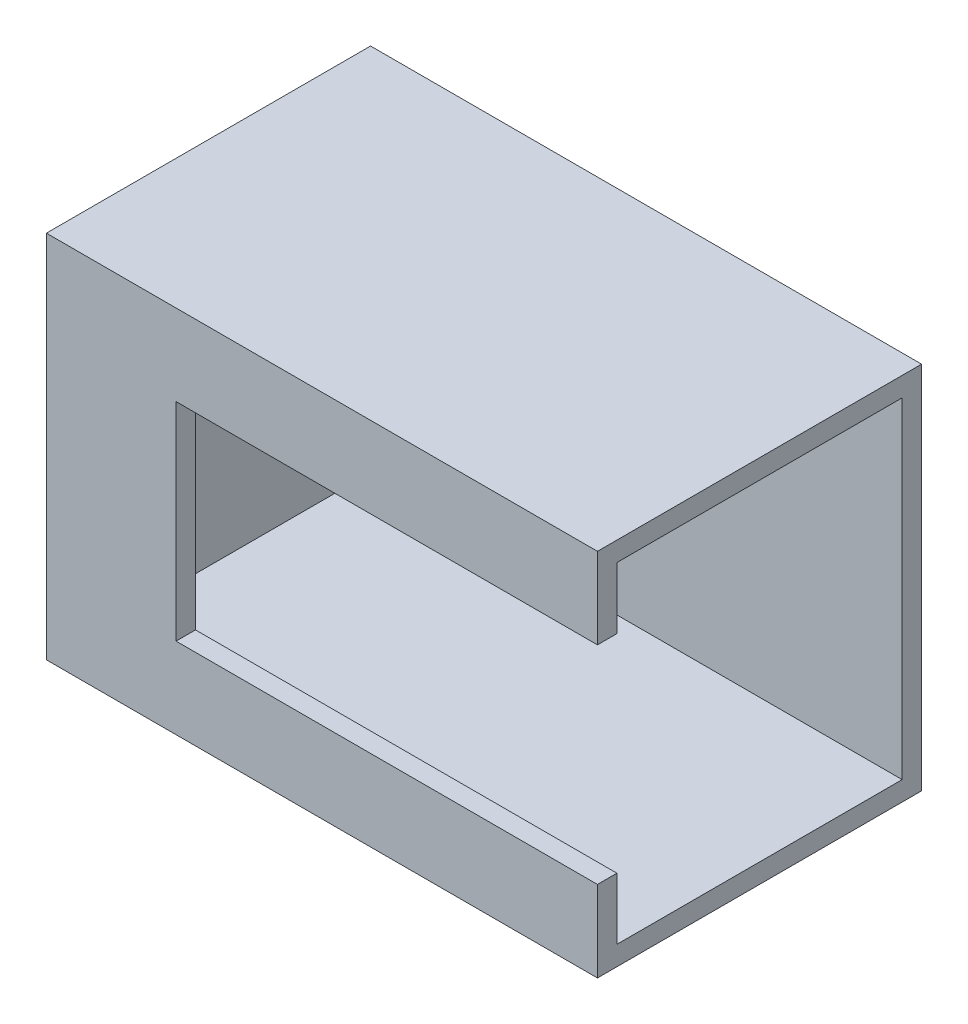
ISO-10303-21;
HEADER;
FILE_DESCRIPTION(('STEP AP214'),'2;1');
FILE_NAME('part.step','',(''),(''),'','','');
FILE_SCHEMA(('AUTOMOTIVE_DESIGN { 1 0 10303 214 1 1 1 1 }'));
ENDSEC;
DATA;
#1=APPLICATION_CONTEXT('core data for automotive mechanical design processes');
#2=APPLICATION_PROTOCOL_DEFINITION('international standard','automotive_design',2000,#1);
#3=PRODUCT_CONTEXT('',#1,'mechanical');
#4=PRODUCT('Part','Part','',(#3));
#5=PRODUCT_RELATED_PRODUCT_CATEGORY('part','',(#4));
#6=PRODUCT_DEFINITION_FORMATION('','',#4);
#7=PRODUCT_DEFINITION_CONTEXT('part definition',#1,'design');
#8=PRODUCT_DEFINITION('design','',#6,#7);
#9=PRODUCT_DEFINITION_SHAPE('','',#8);
#10=(LENGTH_UNIT() NAMED_UNIT(*) SI_UNIT(.MILLI.,.METRE.));
#11=(NAMED_UNIT(*) PLANE_ANGLE_UNIT() SI_UNIT($,.RADIAN.));
#12=(NAMED_UNIT(*) SI_UNIT($,.STERADIAN.) SOLID_ANGLE_UNIT());
#13=UNCERTAINTY_MEASURE_WITH_UNIT(LENGTH_MEASURE(1.E-05),#10,'distance_accuracy_value','');
#14=(GEOMETRIC_REPRESENTATION_CONTEXT(3) GLOBAL_UNCERTAINTY_ASSIGNED_CONTEXT((#13)) GLOBAL_UNIT_ASSIGNED_CONTEXT((#10,
#11,#12)) REPRESENTATION_CONTEXT('',''));
#15=CARTESIAN_POINT('',(0.,0.,0.));
#16=DIRECTION('',(0.,0.,1.));
#17=DIRECTION('',(1.,0.,0.));
#18=AXIS2_PLACEMENT_3D('',#15,#16,#17);
#19=CARTESIAN_POINT('',(42.5,57.,25.));
#20=DIRECTION('',(-1.,0.,0.));
#21=DIRECTION('',(0.,0.,1.));
#22=AXIS2_PLACEMENT_3D('',#19,#20,#21);
#23=PLANE('',#22);
#24=DIRECTION('',(0.,-1.,0.));
#25=VECTOR('',#24,1.);
#26=CARTESIAN_POINT('',(42.5,57.,25.));
#27=LINE('',#26,#25);
#28=CARTESIAN_POINT('',(42.5,57.,25.));
#29=VERTEX_POINT('',#28);
#30=CARTESIAN_POINT('',(42.5,44.5,25.));
#31=VERTEX_POINT('',#30);
#32=EDGE_CURVE('E247',#29,#31,#27,.T.);
#33=ORIENTED_EDGE('',*,*,#32,.T.);
#34=DIRECTION('',(0.,0.,1.));
#35=VECTOR('',#34,1.);
#36=CARTESIAN_POINT('',(42.5,44.5,-25.001));
#37=LINE('',#36,#35);
#38=CARTESIAN_POINT('',(42.5,44.5,22.));
#39=VERTEX_POINT('',#38);
#40=EDGE_CURVE('E173',#39,#31,#37,.T.);
#41=ORIENTED_EDGE('',*,*,#40,.F.);
#42=DIRECTION('',(0.,1.,0.));
#43=VECTOR('',#42,1.);
#44=CARTESIAN_POINT('',(42.5,0.,22.));
#45=LINE('',#44,#43);
#46=CARTESIAN_POINT('',(42.5,54.,22.));
#47=VERTEX_POINT('',#46);
#48=EDGE_CURVE('E68',#39,#47,#45,.T.);
#49=ORIENTED_EDGE('',*,*,#48,.T.);
#50=DIRECTION('',(0.,0.,-1.));
#51=VECTOR('',#50,1.);
#52=CARTESIAN_POINT('',(42.5,54.,0.));
#53=LINE('',#52,#51);
#54=CARTESIAN_POINT('',(42.5,54.,-22.));
#55=VERTEX_POINT('',#54);
#56=EDGE_CURVE('E178',#47,#55,#53,.T.);
#57=ORIENTED_EDGE('',*,*,#56,.T.);
#58=DIRECTION('',(0.,1.,0.));
#59=VECTOR('',#58,1.);
#60=CARTESIAN_POINT('',(42.5,0.,-22.));
#61=LINE('',#60,#59);
#62=CARTESIAN_POINT('',(42.5,2.99999999999999,-22.));
#63=VERTEX_POINT('',#62);
#64=EDGE_CURVE('E183',#63,#55,#61,.T.);
#65=ORIENTED_EDGE('',*,*,#64,.F.);
#66=DIRECTION('',(0.,0.,-1.));
#67=VECTOR('',#66,1.);
#68=CARTESIAN_POINT('',(42.5,2.99999999999999,0.));
#69=LINE('',#68,#67);
#70=CARTESIAN_POINT('',(42.5,2.99999999999999,22.));
#71=VERTEX_POINT('',#70);
#72=EDGE_CURVE('E201',#71,#63,#69,.T.);
#73=ORIENTED_EDGE('',*,*,#72,.F.);
#74=CARTESIAN_POINT('',(42.5,12.5,22.));
#75=VERTEX_POINT('',#74);
#76=EDGE_CURVE('E197',#71,#75,#45,.T.);
#77=ORIENTED_EDGE('',*,*,#76,.T.);
#78=DIRECTION('',(0.,0.,1.));
#79=VECTOR('',#78,1.);
#80=CARTESIAN_POINT('',(42.5,12.5,-25.001));
#81=LINE('',#80,#79);
#82=CARTESIAN_POINT('',(42.5,12.5,25.));
#83=VERTEX_POINT('',#82);
#84=EDGE_CURVE('E60',#75,#83,#81,.T.);
#85=ORIENTED_EDGE('',*,*,#84,.T.);
#86=CARTESIAN_POINT('',(42.5,0.,25.));
#87=VERTEX_POINT('',#86);
#88=EDGE_CURVE('E234',#83,#87,#27,.T.);
#89=ORIENTED_EDGE('',*,*,#88,.T.);
#90=DIRECTION('',(0.,0.,-1.));
#91=VECTOR('',#90,1.);
#92=CARTESIAN_POINT('',(42.5,0.,25.));
#93=LINE('',#92,#91);
#94=CARTESIAN_POINT('',(42.5,0.,-25.));
#95=VERTEX_POINT('',#94);
#96=EDGE_CURVE('E211',#87,#95,#93,.T.);
#97=ORIENTED_EDGE('',*,*,#96,.T.);
#98=DIRECTION('',(0.,-1.,0.));
#99=VECTOR('',#98,1.);
#100=CARTESIAN_POINT('',(42.5,57.,-25.));
#101=LINE('',#100,#99);
#102=CARTESIAN_POINT('',(42.5,57.,-25.));
#103=VERTEX_POINT('',#102);
#104=EDGE_CURVE('E11',#103,#95,#101,.T.);
#105=ORIENTED_EDGE('',*,*,#104,.F.);
#106=DIRECTION('',(0.,0.,-1.));
#107=VECTOR('',#106,1.);
#108=CARTESIAN_POINT('',(42.5,57.,25.));
#109=LINE('',#108,#107);
#110=EDGE_CURVE('E220',#29,#103,#109,.T.);
#111=ORIENTED_EDGE('',*,*,#110,.F.);
#112=EDGE_LOOP('',(#33,#41,#49,#57,#65,#73,#77,#85,#89,#97,#105,#111));
#113=FACE_BOUND('',#112,.T.);
#114=ADVANCED_FACE('F45',(#113),#23,.F.);
#115=CARTESIAN_POINT('',(-42.5,57.,-25.));
#116=DIRECTION('',(0.,0.,1.));
#117=DIRECTION('',(1.,0.,0.));
#118=AXIS2_PLACEMENT_3D('',#115,#116,#117);
#119=PLANE('',#118);
#120=DIRECTION('',(-1.,0.,0.));
#121=VECTOR('',#120,1.);
#122=CARTESIAN_POINT('',(-42.5,0.,-25.));
#123=LINE('',#122,#121);
#124=CARTESIAN_POINT('',(-42.5,0.,-25.));
#125=VERTEX_POINT('',#124);
#126=EDGE_CURVE('E238',#95,#125,#123,.T.);
#127=ORIENTED_EDGE('',*,*,#126,.T.);
#128=DIRECTION('',(0.,-1.,0.));
#129=VECTOR('',#128,1.);
#130=CARTESIAN_POINT('',(-42.5,57.,-25.));
#131=LINE('',#130,#129);
#132=CARTESIAN_POINT('',(-42.5,57.,-25.));
#133=VERTEX_POINT('',#132);
#134=EDGE_CURVE('E53',#133,#125,#131,.T.);
#135=ORIENTED_EDGE('',*,*,#134,.F.);
#136=DIRECTION('',(-1.,0.,0.));
#137=VECTOR('',#136,1.);
#138=CARTESIAN_POINT('',(-42.5,57.,-25.));
#139=LINE('',#138,#137);
#140=EDGE_CURVE('E224',#103,#133,#139,.T.);
#141=ORIENTED_EDGE('',*,*,#140,.F.);
#142=ORIENTED_EDGE('',*,*,#104,.T.);
#143=EDGE_LOOP('',(#127,#135,#141,#142));
#144=FACE_BOUND('',#143,.T.);
#145=ADVANCED_FACE('F277',(#144),#119,.F.);
#146=CARTESIAN_POINT('',(-42.5,57.,25.));
#147=DIRECTION('',(1.,0.,0.));
#148=DIRECTION('',(0.,0.,-1.));
#149=AXIS2_PLACEMENT_3D('',#146,#147,#148);
#150=PLANE('',#149);
#151=DIRECTION('',(0.,0.,1.));
#152=VECTOR('',#151,1.);
#153=CARTESIAN_POINT('',(-42.5,0.,25.));
#154=LINE('',#153,#152);
#155=CARTESIAN_POINT('',(-42.5,0.,25.));
#156=VERTEX_POINT('',#155);
#157=EDGE_CURVE('E241',#125,#156,#154,.T.);
#158=ORIENTED_EDGE('',*,*,#157,.T.);
#159=DIRECTION('',(0.,-1.,0.));
#160=VECTOR('',#159,1.);
#161=CARTESIAN_POINT('',(-42.5,57.,25.));
#162=LINE('',#161,#160);
#163=CARTESIAN_POINT('',(-42.5,57.,25.));
#164=VERTEX_POINT('',#163);
#165=EDGE_CURVE('E251',#164,#156,#162,.T.);
#166=ORIENTED_EDGE('',*,*,#165,.F.);
#167=DIRECTION('',(0.,0.,1.));
#168=VECTOR('',#167,1.);
#169=CARTESIAN_POINT('',(-42.5,57.,25.));
#170=LINE('',#169,#168);
#171=EDGE_CURVE('E228',#133,#164,#170,.T.);
#172=ORIENTED_EDGE('',*,*,#171,.F.);
#173=ORIENTED_EDGE('',*,*,#134,.T.);
#174=EDGE_LOOP('',(#158,#166,#172,#173));
#175=FACE_BOUND('',#174,.T.);
#176=ADVANCED_FACE('F260',(#175),#150,.F.);
#177=CARTESIAN_POINT('',(-42.5,57.,25.));
#178=DIRECTION('',(0.,0.,-1.));
#179=DIRECTION('',(-1.,0.,0.));
#180=AXIS2_PLACEMENT_3D('',#177,#178,#179);
#181=PLANE('',#180);
#182=DIRECTION('',(0.,-1.,0.));
#183=VECTOR('',#182,1.);
#184=CARTESIAN_POINT('',(-22.5,44.5,25.));
#185=LINE('',#184,#183);
#186=CARTESIAN_POINT('',(-22.5,44.5,25.));
#187=VERTEX_POINT('',#186);
#188=CARTESIAN_POINT('',(-22.5,12.5,25.));
#189=VERTEX_POINT('',#188);
#190=EDGE_CURVE('E161',#187,#189,#185,.T.);
#191=ORIENTED_EDGE('',*,*,#190,.F.);
#192=DIRECTION('',(-1.,0.,0.));
#193=VECTOR('',#192,1.);
#194=CARTESIAN_POINT('',(42.5,44.5,25.));
#195=LINE('',#194,#193);
#196=EDGE_CURVE('E151',#31,#187,#195,.T.);
#197=ORIENTED_EDGE('',*,*,#196,.F.);
#198=ORIENTED_EDGE('',*,*,#32,.F.);
#199=DIRECTION('',(1.,0.,0.));
#200=VECTOR('',#199,1.);
#201=CARTESIAN_POINT('',(-42.5,57.,25.));
#202=LINE('',#201,#200);
#203=EDGE_CURVE('E231',#164,#29,#202,.T.);
#204=ORIENTED_EDGE('',*,*,#203,.F.);
#205=ORIENTED_EDGE('',*,*,#165,.T.);
#206=DIRECTION('',(1.,0.,0.));
#207=VECTOR('',#206,1.);
#208=CARTESIAN_POINT('',(-42.5,0.,25.));
#209=LINE('',#208,#207);
#210=EDGE_CURVE('E225',#156,#87,#209,.T.);
#211=ORIENTED_EDGE('',*,*,#210,.T.);
#212=ORIENTED_EDGE('',*,*,#88,.F.);
#213=DIRECTION('',(1.,0.,0.));
#214=VECTOR('',#213,1.);
#215=CARTESIAN_POINT('',(42.5,12.5,25.));
#216=LINE('',#215,#214);
#217=EDGE_CURVE('E158',#189,#83,#216,.T.);
#218=ORIENTED_EDGE('',*,*,#217,.F.);
#219=EDGE_LOOP('',(#191,#197,#198,#204,#205,#211,#212,#218));
#220=FACE_BOUND('',#219,.T.);
#221=ADVANCED_FACE('F269',(#220),#181,.F.);
#222=CARTESIAN_POINT('',(0.,57.,0.));
#223=DIRECTION('',(0.,-1.,0.));
#224=DIRECTION('',(0.,0.,-1.));
#225=AXIS2_PLACEMENT_3D('',#222,#223,#224);
#226=PLANE('',#225);
#227=ORIENTED_EDGE('',*,*,#110,.T.);
#228=ORIENTED_EDGE('',*,*,#140,.T.);
#229=ORIENTED_EDGE('',*,*,#171,.T.);
#230=ORIENTED_EDGE('',*,*,#203,.T.);
#231=EDGE_LOOP('',(#227,#228,#229,#230));
#232=FACE_BOUND('',#231,.T.);
#233=ADVANCED_FACE('F275',(#232),#226,.F.);
#234=CARTESIAN_POINT('',(0.,0.,0.));
#235=DIRECTION('',(0.,-1.,0.));
#236=DIRECTION('',(0.,0.,-1.));
#237=AXIS2_PLACEMENT_3D('',#234,#235,#236);
#238=PLANE('',#237);
#239=ORIENTED_EDGE('',*,*,#96,.F.);
#240=ORIENTED_EDGE('',*,*,#210,.F.);
#241=ORIENTED_EDGE('',*,*,#157,.F.);
#242=ORIENTED_EDGE('',*,*,#126,.F.);
#243=EDGE_LOOP('',(#239,#240,#241,#242));
#244=FACE_BOUND('',#243,.T.);
#245=ADVANCED_FACE('F266',(#244),#238,.T.);
#246=CARTESIAN_POINT('',(-39.5,54.,0.));
#247=DIRECTION('',(0.,-1.,0.));
#248=DIRECTION('',(0.,0.,-1.));
#249=AXIS2_PLACEMENT_3D('',#246,#247,#248);
#250=PLANE('',#249);
#251=ORIENTED_EDGE('',*,*,#56,.F.);
#252=DIRECTION('',(1.,0.,0.));
#253=VECTOR('',#252,1.);
#254=CARTESIAN_POINT('',(-39.5,54.,22.));
#255=LINE('',#254,#253);
#256=CARTESIAN_POINT('',(-39.5,54.,22.));
#257=VERTEX_POINT('',#256);
#258=EDGE_CURVE('E194',#257,#47,#255,.T.);
#259=ORIENTED_EDGE('',*,*,#258,.F.);
#260=DIRECTION('',(0.,0.,-1.));
#261=VECTOR('',#260,1.);
#262=CARTESIAN_POINT('',(-39.5,54.,0.));
#263=LINE('',#262,#261);
#264=CARTESIAN_POINT('',(-39.5,54.,-22.));
#265=VERTEX_POINT('',#264);
#266=EDGE_CURVE('E179',#257,#265,#263,.T.);
#267=ORIENTED_EDGE('',*,*,#266,.T.);
#268=DIRECTION('',(1.,0.,0.));
#269=VECTOR('',#268,1.);
#270=CARTESIAN_POINT('',(-39.5,54.,-22.));
#271=LINE('',#270,#269);
#272=EDGE_CURVE('E208',#265,#55,#271,.T.);
#273=ORIENTED_EDGE('',*,*,#272,.T.);
#274=EDGE_LOOP('',(#251,#259,#267,#273));
#275=FACE_BOUND('',#274,.T.);
#276=ADVANCED_FACE('F305',(#275),#250,.T.);
#277=CARTESIAN_POINT('',(-39.5,0.,-22.));
#278=DIRECTION('',(0.,0.,-1.));
#279=DIRECTION('',(-1.,0.,0.));
#280=AXIS2_PLACEMENT_3D('',#277,#278,#279);
#281=PLANE('',#280);
#282=ORIENTED_EDGE('',*,*,#64,.T.);
#283=ORIENTED_EDGE('',*,*,#272,.F.);
#284=DIRECTION('',(0.,1.,0.));
#285=VECTOR('',#284,1.);
#286=CARTESIAN_POINT('',(-39.5,0.,-22.));
#287=LINE('',#286,#285);
#288=CARTESIAN_POINT('',(-39.5,2.99999999999999,-22.));
#289=VERTEX_POINT('',#288);
#290=EDGE_CURVE('E190',#289,#265,#287,.T.);
#291=ORIENTED_EDGE('',*,*,#290,.F.);
#292=DIRECTION('',(1.,0.,0.));
#293=VECTOR('',#292,1.);
#294=CARTESIAN_POINT('',(-39.5,2.99999999999999,-22.));
#295=LINE('',#294,#293);
#296=EDGE_CURVE('E212',#289,#63,#295,.T.);
#297=ORIENTED_EDGE('',*,*,#296,.T.);
#298=EDGE_LOOP('',(#282,#283,#291,#297));
#299=FACE_BOUND('',#298,.T.);
#300=ADVANCED_FACE('F310',(#299),#281,.F.);
#301=CARTESIAN_POINT('',(-39.5,2.99999999999999,0.));
#302=DIRECTION('',(0.,-1.,0.));
#303=DIRECTION('',(0.,0.,-1.));
#304=AXIS2_PLACEMENT_3D('',#301,#302,#303);
#305=PLANE('',#304);
#306=ORIENTED_EDGE('',*,*,#72,.T.);
#307=ORIENTED_EDGE('',*,*,#296,.F.);
#308=DIRECTION('',(0.,0.,-1.));
#309=VECTOR('',#308,1.);
#310=CARTESIAN_POINT('',(-39.5,2.99999999999999,0.));
#311=LINE('',#310,#309);
#312=CARTESIAN_POINT('',(-39.5,2.99999999999999,22.));
#313=VERTEX_POINT('',#312);
#314=EDGE_CURVE('E186',#313,#289,#311,.T.);
#315=ORIENTED_EDGE('',*,*,#314,.F.);
#316=DIRECTION('',(1.,0.,0.));
#317=VECTOR('',#316,1.);
#318=CARTESIAN_POINT('',(-39.5,2.99999999999999,22.));
#319=LINE('',#318,#317);
#320=EDGE_CURVE('E215',#313,#71,#319,.T.);
#321=ORIENTED_EDGE('',*,*,#320,.T.);
#322=EDGE_LOOP('',(#306,#307,#315,#321));
#323=FACE_BOUND('',#322,.T.);
#324=ADVANCED_FACE('F315',(#323),#305,.F.);
#325=CARTESIAN_POINT('',(-39.5,0.,22.));
#326=DIRECTION('',(0.,0.,-1.));
#327=DIRECTION('',(-1.,0.,0.));
#328=AXIS2_PLACEMENT_3D('',#325,#326,#327);
#329=PLANE('',#328);
#330=DIRECTION('',(-1.,0.,0.));
#331=VECTOR('',#330,1.);
#332=CARTESIAN_POINT('',(42.5,44.5,22.));
#333=LINE('',#332,#331);
#334=CARTESIAN_POINT('',(-22.5,44.5,22.));
#335=VERTEX_POINT('',#334);
#336=EDGE_CURVE('E149',#39,#335,#333,.T.);
#337=ORIENTED_EDGE('',*,*,#336,.T.);
#338=DIRECTION('',(0.,-1.,0.));
#339=VECTOR('',#338,1.);
#340=CARTESIAN_POINT('',(-22.5,44.5,22.));
#341=LINE('',#340,#339);
#342=CARTESIAN_POINT('',(-22.5,12.5,22.));
#343=VERTEX_POINT('',#342);
#344=EDGE_CURVE('E136',#335,#343,#341,.T.);
#345=ORIENTED_EDGE('',*,*,#344,.T.);
#346=DIRECTION('',(1.,0.,0.));
#347=VECTOR('',#346,1.);
#348=CARTESIAN_POINT('',(42.5,12.5,22.));
#349=LINE('',#348,#347);
#350=EDGE_CURVE('E168',#343,#75,#349,.T.);
#351=ORIENTED_EDGE('',*,*,#350,.T.);
#352=ORIENTED_EDGE('',*,*,#76,.F.);
#353=ORIENTED_EDGE('',*,*,#320,.F.);
#354=DIRECTION('',(0.,1.,0.));
#355=VECTOR('',#354,1.);
#356=CARTESIAN_POINT('',(-39.5,0.,22.));
#357=LINE('',#356,#355);
#358=EDGE_CURVE('E182',#313,#257,#357,.T.);
#359=ORIENTED_EDGE('',*,*,#358,.T.);
#360=ORIENTED_EDGE('',*,*,#258,.T.);
#361=ORIENTED_EDGE('',*,*,#48,.F.);
#362=EDGE_LOOP('',(#337,#345,#351,#352,#353,#359,#360,#361));
#363=FACE_BOUND('',#362,.T.);
#364=ADVANCED_FACE('F155',(#363),#329,.T.);
#365=CARTESIAN_POINT('',(-39.5,0.,0.));
#366=DIRECTION('',(1.,0.,0.));
#367=DIRECTION('',(0.,0.,-1.));
#368=AXIS2_PLACEMENT_3D('',#365,#366,#367);
#369=PLANE('',#368);
#370=ORIENTED_EDGE('',*,*,#266,.F.);
#371=ORIENTED_EDGE('',*,*,#358,.F.);
#372=ORIENTED_EDGE('',*,*,#314,.T.);
#373=ORIENTED_EDGE('',*,*,#290,.T.);
#374=EDGE_LOOP('',(#370,#371,#372,#373));
#375=FACE_BOUND('',#374,.T.);
#376=ADVANCED_FACE('F314',(#375),#369,.T.);
#377=CARTESIAN_POINT('',(42.5,44.5,-25.001));
#378=DIRECTION('',(0.,1.,0.));
#379=DIRECTION('',(-1.,0.,0.));
#380=AXIS2_PLACEMENT_3D('',#377,#378,#379);
#381=PLANE('',#380);
#382=ORIENTED_EDGE('',*,*,#40,.T.);
#383=ORIENTED_EDGE('',*,*,#196,.T.);
#384=DIRECTION('',(0.,0.,1.));
#385=VECTOR('',#384,1.);
#386=CARTESIAN_POINT('',(-22.5,44.5,-25.001));
#387=LINE('',#386,#385);
#388=EDGE_CURVE('E140',#335,#187,#387,.T.);
#389=ORIENTED_EDGE('',*,*,#388,.F.);
#390=ORIENTED_EDGE('',*,*,#336,.F.);
#391=EDGE_LOOP('',(#382,#383,#389,#390));
#392=FACE_BOUND('',#391,.T.);
#393=ADVANCED_FACE('F148',(#392),#381,.F.);
#394=CARTESIAN_POINT('',(-22.5,44.5,-25.001));
#395=DIRECTION('',(-1.,0.,0.));
#396=DIRECTION('',(0.,-1.,0.));
#397=AXIS2_PLACEMENT_3D('',#394,#395,#396);
#398=PLANE('',#397);
#399=ORIENTED_EDGE('',*,*,#388,.T.);
#400=ORIENTED_EDGE('',*,*,#190,.T.);
#401=DIRECTION('',(0.,0.,1.));
#402=VECTOR('',#401,1.);
#403=CARTESIAN_POINT('',(-22.5,12.5,-25.001));
#404=LINE('',#403,#402);
#405=EDGE_CURVE('E142',#343,#189,#404,.T.);
#406=ORIENTED_EDGE('',*,*,#405,.F.);
#407=ORIENTED_EDGE('',*,*,#344,.F.);
#408=EDGE_LOOP('',(#399,#400,#406,#407));
#409=FACE_BOUND('',#408,.T.);
#410=ADVANCED_FACE('F138',(#409),#398,.F.);
#411=CARTESIAN_POINT('',(42.5,12.5,-25.001));
#412=DIRECTION('',(0.,-1.,0.));
#413=DIRECTION('',(1.,0.,0.));
#414=AXIS2_PLACEMENT_3D('',#411,#412,#413);
#415=PLANE('',#414);
#416=ORIENTED_EDGE('',*,*,#405,.T.);
#417=ORIENTED_EDGE('',*,*,#217,.T.);
#418=ORIENTED_EDGE('',*,*,#84,.F.);
#419=ORIENTED_EDGE('',*,*,#350,.F.);
#420=EDGE_LOOP('',(#416,#417,#418,#419));
#421=FACE_BOUND('',#420,.T.);
#422=ADVANCED_FACE('F284',(#421),#415,.F.);
#423=CLOSED_SHELL('',(#114,#145,#176,#221,#233,#245,#276,#300,#324,#364,#376,#393,#410,#422));
#424=MANIFOLD_SOLID_BREP('B2',#423);
#425=ADVANCED_BREP_SHAPE_REPRESENTATION('',(#18,#424),#14);
#426=SHAPE_DEFINITION_REPRESENTATION(#9,#425);
ENDSEC;
END-ISO-10303-21;
